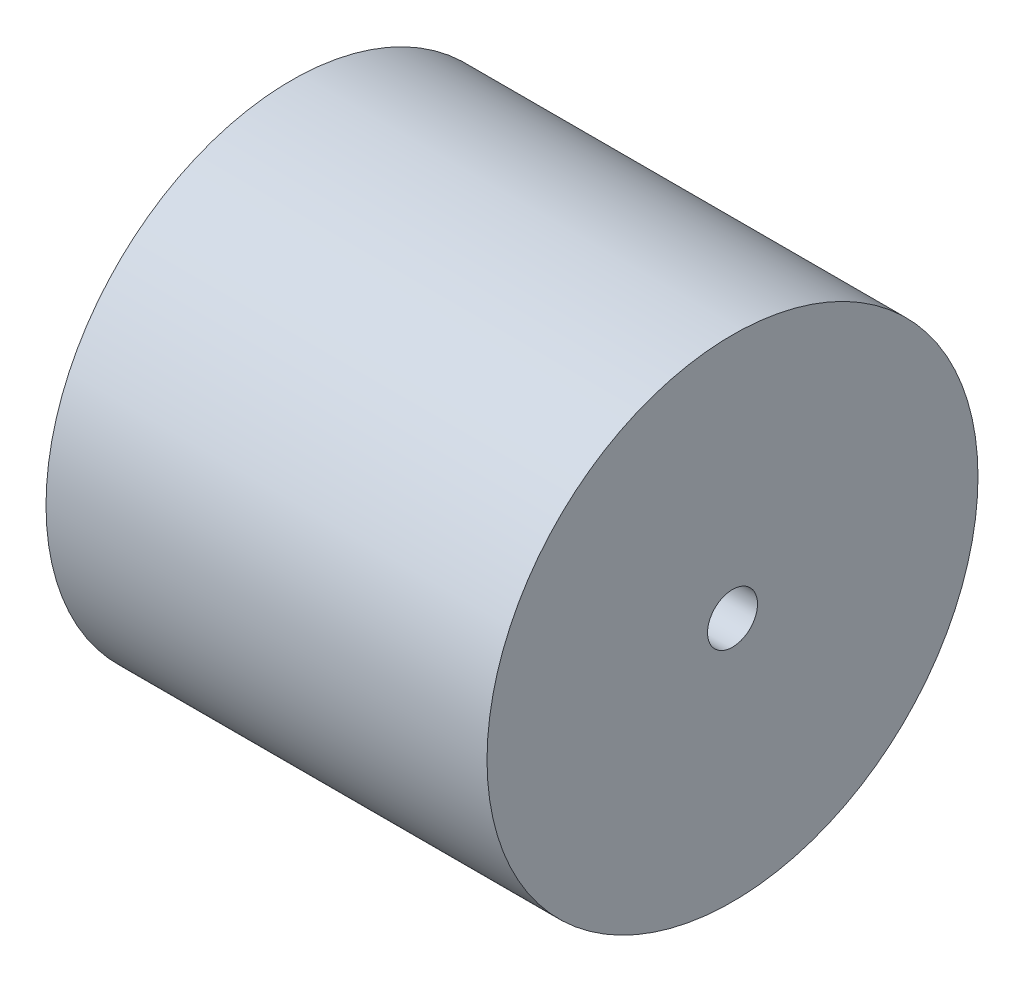
ISO-10303-21;
HEADER;
FILE_DESCRIPTION(('STEP AP214'),'2;1');
FILE_NAME('part.step','',(''),(''),'','','');
FILE_SCHEMA(('AUTOMOTIVE_DESIGN { 1 0 10303 214 1 1 1 1 }'));
ENDSEC;
DATA;
#1=APPLICATION_CONTEXT('core data for automotive mechanical design processes');
#2=APPLICATION_PROTOCOL_DEFINITION('international standard','automotive_design',2000,#1);
#3=PRODUCT_CONTEXT('',#1,'mechanical');
#4=PRODUCT('Part','Part','',(#3));
#5=PRODUCT_RELATED_PRODUCT_CATEGORY('part','',(#4));
#6=PRODUCT_DEFINITION_FORMATION('','',#4);
#7=PRODUCT_DEFINITION_CONTEXT('part definition',#1,'design');
#8=PRODUCT_DEFINITION('design','',#6,#7);
#9=PRODUCT_DEFINITION_SHAPE('','',#8);
#10=(LENGTH_UNIT() NAMED_UNIT(*) SI_UNIT(.MILLI.,.METRE.));
#11=(NAMED_UNIT(*) PLANE_ANGLE_UNIT() SI_UNIT($,.RADIAN.));
#12=(NAMED_UNIT(*) SI_UNIT($,.STERADIAN.) SOLID_ANGLE_UNIT());
#13=UNCERTAINTY_MEASURE_WITH_UNIT(LENGTH_MEASURE(1.E-05),#10,'distance_accuracy_value','');
#14=(GEOMETRIC_REPRESENTATION_CONTEXT(3) GLOBAL_UNCERTAINTY_ASSIGNED_CONTEXT((#13)) GLOBAL_UNIT_ASSIGNED_CONTEXT((#10,
#11,#12)) REPRESENTATION_CONTEXT('',''));
#15=CARTESIAN_POINT('',(0.,0.,0.));
#16=DIRECTION('',(0.,0.,1.));
#17=DIRECTION('',(1.,0.,0.));
#18=AXIS2_PLACEMENT_3D('',#15,#16,#17);
#19=CARTESIAN_POINT('',(30.,0.,0.));
#20=DIRECTION('',(-1.,0.,0.));
#21=DIRECTION('',(0.,0.,1.));
#22=AXIS2_PLACEMENT_3D('',#19,#20,#21);
#23=CYLINDRICAL_SURFACE('',#22,16.7);
#24=CARTESIAN_POINT('',(30.,0.,0.));
#25=DIRECTION('',(1.,0.,0.));
#26=DIRECTION('',(0.,0.,-1.));
#27=AXIS2_PLACEMENT_3D('',#24,#25,#26);
#28=CIRCLE('',#27,16.7);
#29=CARTESIAN_POINT('',(30.,0.,-16.7));
#30=VERTEX_POINT('',#29);
#31=EDGE_CURVE('E10',#30,#30,#28,.T.);
#32=ORIENTED_EDGE('',*,*,#31,.F.);
#33=EDGE_LOOP('',(#32));
#34=FACE_BOUND('',#33,.T.);
#35=CARTESIAN_POINT('',(0.,0.,0.));
#36=DIRECTION('',(1.,0.,0.));
#37=DIRECTION('',(0.,0.,-1.));
#38=AXIS2_PLACEMENT_3D('',#35,#36,#37);
#39=CIRCLE('',#38,16.7);
#40=CARTESIAN_POINT('',(0.,0.,-16.7));
#41=VERTEX_POINT('',#40);
#42=EDGE_CURVE('E37',#41,#41,#39,.T.);
#43=ORIENTED_EDGE('',*,*,#42,.T.);
#44=EDGE_LOOP('',(#43));
#45=FACE_BOUND('',#44,.T.);
#46=ADVANCED_FACE('F40',(#34,#45),#23,.T.);
#47=CARTESIAN_POINT('',(30.,0.,0.));
#48=DIRECTION('',(1.,0.,0.));
#49=DIRECTION('',(0.,0.,-1.));
#50=AXIS2_PLACEMENT_3D('',#47,#48,#49);
#51=PLANE('',#50);
#52=CARTESIAN_POINT('',(30.,0.,0.));
#53=DIRECTION('',(1.,0.,0.));
#54=DIRECTION('',(0.,0.,-1.));
#55=AXIS2_PLACEMENT_3D('',#52,#53,#54);
#56=CIRCLE('',#55,1.7);
#57=CARTESIAN_POINT('',(30.,0.,-1.7));
#58=VERTEX_POINT('',#57);
#59=EDGE_CURVE('E51',#58,#58,#56,.T.);
#60=ORIENTED_EDGE('',*,*,#59,.F.);
#61=EDGE_LOOP('',(#60));
#62=FACE_BOUND('',#61,.T.);
#63=ORIENTED_EDGE('',*,*,#31,.T.);
#64=EDGE_LOOP('',(#63));
#65=FACE_BOUND('',#64,.T.);
#66=ADVANCED_FACE('F59',(#62,#65),#51,.T.);
#67=CARTESIAN_POINT('',(0.,0.,0.));
#68=DIRECTION('',(1.,0.,0.));
#69=DIRECTION('',(0.,0.,-1.));
#70=AXIS2_PLACEMENT_3D('',#67,#68,#69);
#71=PLANE('',#70);
#72=CARTESIAN_POINT('',(0.,0.,0.));
#73=DIRECTION('',(1.,0.,0.));
#74=DIRECTION('',(0.,0.,-1.));
#75=AXIS2_PLACEMENT_3D('',#72,#73,#74);
#76=CIRCLE('',#75,1.7);
#77=CARTESIAN_POINT('',(0.,0.,-1.7));
#78=VERTEX_POINT('',#77);
#79=EDGE_CURVE('E50',#78,#78,#76,.F.);
#80=ORIENTED_EDGE('',*,*,#79,.F.);
#81=EDGE_LOOP('',(#80));
#82=FACE_BOUND('',#81,.T.);
#83=ORIENTED_EDGE('',*,*,#42,.F.);
#84=EDGE_LOOP('',(#83));
#85=FACE_BOUND('',#84,.T.);
#86=ADVANCED_FACE('F58',(#82,#85),#71,.F.);
#87=CARTESIAN_POINT('',(-0.001000000000001,0.,0.));
#88=DIRECTION('',(1.,0.,0.));
#89=DIRECTION('',(0.,0.,-1.));
#90=AXIS2_PLACEMENT_3D('',#87,#88,#89);
#91=CYLINDRICAL_SURFACE('',#90,1.7);
#92=ORIENTED_EDGE('',*,*,#59,.T.);
#93=EDGE_LOOP('',(#92));
#94=FACE_BOUND('',#93,.T.);
#95=ORIENTED_EDGE('',*,*,#79,.T.);
#96=EDGE_LOOP('',(#95));
#97=FACE_BOUND('',#96,.T.);
#98=ADVANCED_FACE('F54',(#94,#97),#91,.F.);
#99=CLOSED_SHELL('',(#46,#66,#86,#98));
#100=MANIFOLD_SOLID_BREP('B2',#99);
#101=ADVANCED_BREP_SHAPE_REPRESENTATION('',(#18,#100),#14);
#102=SHAPE_DEFINITION_REPRESENTATION(#9,#101);
ENDSEC;
END-ISO-10303-21;
